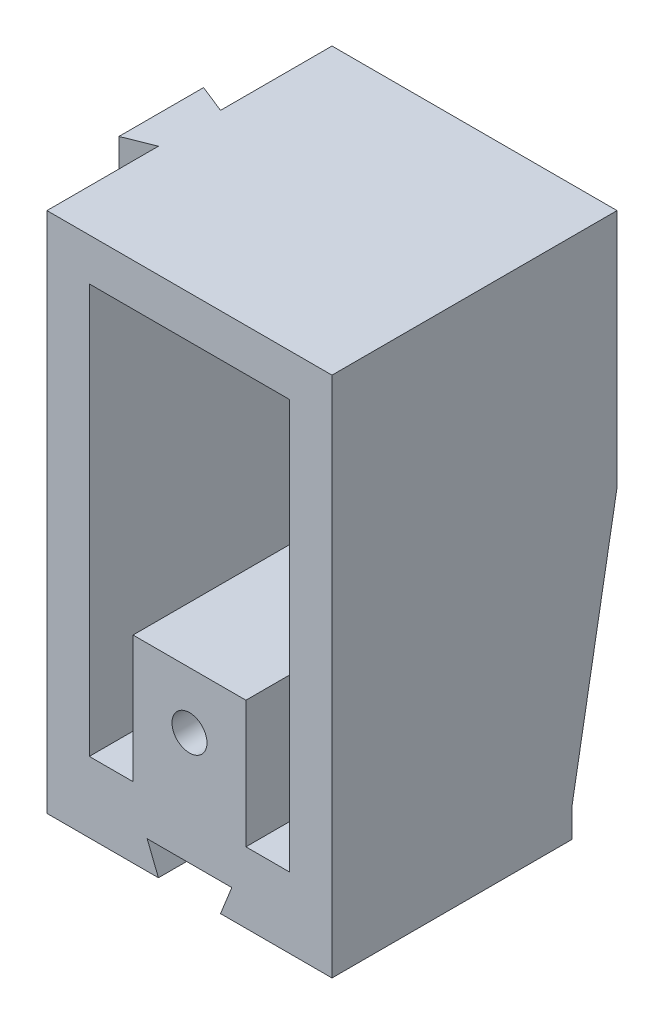
ISO-10303-21;
HEADER;
FILE_DESCRIPTION(('STEP AP214'),'2;1');
FILE_NAME('part.step','',(''),(''),'','','');
FILE_SCHEMA(('AUTOMOTIVE_DESIGN { 1 0 10303 214 1 1 1 1 }'));
ENDSEC;
DATA;
#1=APPLICATION_CONTEXT('core data for automotive mechanical design processes');
#2=APPLICATION_PROTOCOL_DEFINITION('international standard','automotive_design',2000,#1);
#3=PRODUCT_CONTEXT('',#1,'mechanical');
#4=PRODUCT('Part','Part','',(#3));
#5=PRODUCT_RELATED_PRODUCT_CATEGORY('part','',(#4));
#6=PRODUCT_DEFINITION_FORMATION('','',#4);
#7=PRODUCT_DEFINITION_CONTEXT('part definition',#1,'design');
#8=PRODUCT_DEFINITION('design','',#6,#7);
#9=PRODUCT_DEFINITION_SHAPE('','',#8);
#10=(LENGTH_UNIT() NAMED_UNIT(*) SI_UNIT(.MILLI.,.METRE.));
#11=(NAMED_UNIT(*) PLANE_ANGLE_UNIT() SI_UNIT($,.RADIAN.));
#12=(NAMED_UNIT(*) SI_UNIT($,.STERADIAN.) SOLID_ANGLE_UNIT());
#13=UNCERTAINTY_MEASURE_WITH_UNIT(LENGTH_MEASURE(1.E-05),#10,'distance_accuracy_value','');
#14=(GEOMETRIC_REPRESENTATION_CONTEXT(3) GLOBAL_UNCERTAINTY_ASSIGNED_CONTEXT((#13)) GLOBAL_UNIT_ASSIGNED_CONTEXT((#10,
#11,#12)) REPRESENTATION_CONTEXT('',''));
#15=CARTESIAN_POINT('',(0.,0.,0.));
#16=DIRECTION('',(0.,0.,1.));
#17=DIRECTION('',(1.,0.,0.));
#18=AXIS2_PLACEMENT_3D('',#15,#16,#17);
#19=CARTESIAN_POINT('',(50.5,42.5,-25.25));
#20=DIRECTION('',(0.,0.,-1.));
#21=DIRECTION('',(1.,0.,0.));
#22=AXIS2_PLACEMENT_3D('',#19,#20,#21);
#23=PLANE('',#22);
#24=DIRECTION('',(-1.,0.,0.));
#25=VECTOR('',#24,1.);
#26=CARTESIAN_POINT('',(95.25,0.,-25.25));
#27=LINE('',#26,#25);
#28=CARTESIAN_POINT('',(32.75,0.,-25.25));
#29=VERTEX_POINT('',#28);
#30=CARTESIAN_POINT('',(25.25,0.,-25.25));
#31=VERTEX_POINT('',#30);
#32=EDGE_CURVE('E267',#29,#31,#27,.T.);
#33=ORIENTED_EDGE('',*,*,#32,.T.);
#34=DIRECTION('',(0.,-1.,0.));
#35=VECTOR('',#34,1.);
#36=CARTESIAN_POINT('',(25.25,42.5,-25.25));
#37=LINE('',#36,#35);
#38=CARTESIAN_POINT('',(25.25,42.5,-25.25));
#39=VERTEX_POINT('',#38);
#40=EDGE_CURVE('E308',#39,#31,#37,.T.);
#41=ORIENTED_EDGE('',*,*,#40,.F.);
#42=DIRECTION('',(-1.,0.,0.));
#43=VECTOR('',#42,1.);
#44=CARTESIAN_POINT('',(50.5,42.5,-25.25));
#45=LINE('',#44,#43);
#46=CARTESIAN_POINT('',(75.75,42.5,-25.25));
#47=VERTEX_POINT('',#46);
#48=EDGE_CURVE('E312',#47,#39,#45,.T.);
#49=ORIENTED_EDGE('',*,*,#48,.F.);
#50=DIRECTION('',(0.,-1.,0.));
#51=VECTOR('',#50,1.);
#52=CARTESIAN_POINT('',(75.75,42.5,-25.25));
#53=LINE('',#52,#51);
#54=CARTESIAN_POINT('',(75.75,0.,-25.25));
#55=VERTEX_POINT('',#54);
#56=EDGE_CURVE('E349',#47,#55,#53,.T.);
#57=ORIENTED_EDGE('',*,*,#56,.T.);
#58=CARTESIAN_POINT('',(68.25,0.,-25.25));
#59=VERTEX_POINT('',#58);
#60=EDGE_CURVE('E263',#55,#59,#27,.T.);
#61=ORIENTED_EDGE('',*,*,#60,.T.);
#62=DIRECTION('',(0.,1.,0.));
#63=VECTOR('',#62,1.);
#64=CARTESIAN_POINT('',(68.25,42.5,-25.25));
#65=LINE('',#64,#63);
#66=CARTESIAN_POINT('',(68.25,35.,-25.25));
#67=VERTEX_POINT('',#66);
#68=EDGE_CURVE('E238',#59,#67,#65,.T.);
#69=ORIENTED_EDGE('',*,*,#68,.T.);
#70=DIRECTION('',(1.,0.,0.));
#71=VECTOR('',#70,1.);
#72=CARTESIAN_POINT('',(50.5,35.,-25.25));
#73=LINE('',#72,#71);
#74=CARTESIAN_POINT('',(32.75,35.,-25.25));
#75=VERTEX_POINT('',#74);
#76=EDGE_CURVE('E205',#75,#67,#73,.T.);
#77=ORIENTED_EDGE('',*,*,#76,.F.);
#78=DIRECTION('',(0.,1.,0.));
#79=VECTOR('',#78,1.);
#80=CARTESIAN_POINT('',(32.75,42.5,-25.25));
#81=LINE('',#80,#79);
#82=EDGE_CURVE('E250',#29,#75,#81,.T.);
#83=ORIENTED_EDGE('',*,*,#82,.F.);
#84=EDGE_LOOP('',(#33,#41,#49,#57,#61,#69,#77,#83));
#85=FACE_BOUND('',#84,.T.);
#86=ADVANCED_FACE('F43',(#85),#23,.T.);
#87=CARTESIAN_POINT('',(50.5,42.5,25.25));
#88=DIRECTION('',(0.,0.,-1.));
#89=DIRECTION('',(1.,0.,0.));
#90=AXIS2_PLACEMENT_3D('',#87,#88,#89);
#91=PLANE('',#90);
#92=DIRECTION('',(-1.,0.,0.));
#93=VECTOR('',#92,1.);
#94=CARTESIAN_POINT('',(50.5,-45.,25.25));
#95=LINE('',#94,#93);
#96=CARTESIAN_POINT('',(58.,-45.,25.25));
#97=VERTEX_POINT('',#96);
#98=CARTESIAN_POINT('',(43.,-45.,25.25));
#99=VERTEX_POINT('',#98);
#100=EDGE_CURVE('E358',#97,#99,#95,.T.);
#101=ORIENTED_EDGE('',*,*,#100,.F.);
#102=DIRECTION('',(0.371390676354104,0.92847669088526,0.));
#103=VECTOR('',#102,1.);
#104=CARTESIAN_POINT('',(87.1379310344828,27.8448275862069,25.25));
#105=LINE('',#104,#103);
#106=CARTESIAN_POINT('',(56.,-50.,25.25));
#107=VERTEX_POINT('',#106);
#108=EDGE_CURVE('E287',#107,#97,#105,.T.);
#109=ORIENTED_EDGE('',*,*,#108,.F.);
#110=DIRECTION('',(-1.,0.,0.));
#111=VECTOR('',#110,1.);
#112=CARTESIAN_POINT('',(50.5,-50.,25.25));
#113=LINE('',#112,#111);
#114=CARTESIAN_POINT('',(75.75,-50.,25.25));
#115=VERTEX_POINT('',#114);
#116=EDGE_CURVE('E300',#115,#107,#113,.T.);
#117=ORIENTED_EDGE('',*,*,#116,.F.);
#118=DIRECTION('',(0.,-1.,0.));
#119=VECTOR('',#118,1.);
#120=CARTESIAN_POINT('',(75.75,42.5,25.25));
#121=LINE('',#120,#119);
#122=CARTESIAN_POINT('',(75.75,42.5,25.25));
#123=VERTEX_POINT('',#122);
#124=EDGE_CURVE('E346',#123,#115,#121,.T.);
#125=ORIENTED_EDGE('',*,*,#124,.F.);
#126=DIRECTION('',(-1.,0.,0.));
#127=VECTOR('',#126,1.);
#128=CARTESIAN_POINT('',(50.5,42.5,25.25));
#129=LINE('',#128,#127);
#130=CARTESIAN_POINT('',(25.25,42.5,25.25));
#131=VERTEX_POINT('',#130);
#132=EDGE_CURVE('E319',#123,#131,#129,.T.);
#133=ORIENTED_EDGE('',*,*,#132,.T.);
#134=DIRECTION('',(0.,-1.,0.));
#135=VECTOR('',#134,1.);
#136=CARTESIAN_POINT('',(25.25,42.5,25.25));
#137=LINE('',#136,#135);
#138=CARTESIAN_POINT('',(25.25,-50.,25.25));
#139=VERTEX_POINT('',#138);
#140=EDGE_CURVE('E343',#131,#139,#137,.T.);
#141=ORIENTED_EDGE('',*,*,#140,.T.);
#142=CARTESIAN_POINT('',(45.,-50.,25.25));
#143=VERTEX_POINT('',#142);
#144=EDGE_CURVE('E299',#143,#139,#113,.T.);
#145=ORIENTED_EDGE('',*,*,#144,.F.);
#146=DIRECTION('',(0.371390676354104,-0.92847669088526,0.));
#147=VECTOR('',#146,1.);
#148=CARTESIAN_POINT('',(13.8620689655173,27.8448275862069,25.25));
#149=LINE('',#148,#147);
#150=EDGE_CURVE('E292',#99,#143,#149,.T.);
#151=ORIENTED_EDGE('',*,*,#150,.F.);
#152=EDGE_LOOP('',(#101,#109,#117,#125,#133,#141,#145,#151));
#153=FACE_BOUND('',#152,.T.);
#154=CARTESIAN_POINT('',(50.5,-25.,25.25));
#155=DIRECTION('',(0.,0.,-1.));
#156=DIRECTION('',(-1.,0.,0.));
#157=AXIS2_PLACEMENT_3D('',#154,#155,#156);
#158=CIRCLE('',#157,3.1);
#159=CARTESIAN_POINT('',(47.4,-25.,25.25));
#160=VERTEX_POINT('',#159);
#161=EDGE_CURVE('E253',#160,#160,#158,.T.);
#162=ORIENTED_EDGE('',*,*,#161,.T.);
#163=EDGE_LOOP('',(#162));
#164=FACE_BOUND('',#163,.T.);
#165=DIRECTION('',(0.,-1.,0.));
#166=VECTOR('',#165,1.);
#167=CARTESIAN_POINT('',(32.75,0.,25.25));
#168=LINE('',#167,#166);
#169=CARTESIAN_POINT('',(32.75,35.,25.25));
#170=VERTEX_POINT('',#169);
#171=CARTESIAN_POINT('',(32.75,-37.5,25.25));
#172=VERTEX_POINT('',#171);
#173=EDGE_CURVE('E219',#170,#172,#168,.T.);
#174=ORIENTED_EDGE('',*,*,#173,.F.);
#175=DIRECTION('',(-1.,0.,0.));
#176=VECTOR('',#175,1.);
#177=CARTESIAN_POINT('',(50.5,35.,25.25));
#178=LINE('',#177,#176);
#179=CARTESIAN_POINT('',(68.25,35.,25.25));
#180=VERTEX_POINT('',#179);
#181=EDGE_CURVE('E202',#180,#170,#178,.T.);
#182=ORIENTED_EDGE('',*,*,#181,.F.);
#183=DIRECTION('',(0.,-1.,0.));
#184=VECTOR('',#183,1.);
#185=CARTESIAN_POINT('',(68.25,0.,25.25));
#186=LINE('',#185,#184);
#187=CARTESIAN_POINT('',(68.25,-37.5,25.25));
#188=VERTEX_POINT('',#187);
#189=EDGE_CURVE('E211',#180,#188,#186,.T.);
#190=ORIENTED_EDGE('',*,*,#189,.T.);
#191=DIRECTION('',(-1.,0.,0.));
#192=VECTOR('',#191,1.);
#193=CARTESIAN_POINT('',(50.5,-37.5,25.25));
#194=LINE('',#193,#192);
#195=CARTESIAN_POINT('',(60.5,-37.5,25.25));
#196=VERTEX_POINT('',#195);
#197=EDGE_CURVE('E215',#188,#196,#194,.T.);
#198=ORIENTED_EDGE('',*,*,#197,.T.);
#199=DIRECTION('',(0.,-1.,0.));
#200=VECTOR('',#199,1.);
#201=CARTESIAN_POINT('',(60.5,0.,25.25));
#202=LINE('',#201,#200);
#203=CARTESIAN_POINT('',(60.5,-15.,25.25));
#204=VERTEX_POINT('',#203);
#205=EDGE_CURVE('E224',#204,#196,#202,.T.);
#206=ORIENTED_EDGE('',*,*,#205,.F.);
#207=DIRECTION('',(-1.,0.,0.));
#208=VECTOR('',#207,1.);
#209=CARTESIAN_POINT('',(50.5,-15.,25.25));
#210=LINE('',#209,#208);
#211=CARTESIAN_POINT('',(40.5,-15.,25.25));
#212=VERTEX_POINT('',#211);
#213=EDGE_CURVE('E227',#204,#212,#210,.T.);
#214=ORIENTED_EDGE('',*,*,#213,.T.);
#215=DIRECTION('',(0.,-1.,0.));
#216=VECTOR('',#215,1.);
#217=CARTESIAN_POINT('',(40.5,0.,25.25));
#218=LINE('',#217,#216);
#219=CARTESIAN_POINT('',(40.5,-37.5,25.25));
#220=VERTEX_POINT('',#219);
#221=EDGE_CURVE('E230',#212,#220,#218,.T.);
#222=ORIENTED_EDGE('',*,*,#221,.T.);
#223=DIRECTION('',(1.,0.,0.));
#224=VECTOR('',#223,1.);
#225=CARTESIAN_POINT('',(50.5,-37.5,25.25));
#226=LINE('',#225,#224);
#227=EDGE_CURVE('E233',#172,#220,#226,.T.);
#228=ORIENTED_EDGE('',*,*,#227,.F.);
#229=EDGE_LOOP('',(#174,#182,#190,#198,#206,#214,#222,#228));
#230=FACE_BOUND('',#229,.T.);
#231=ADVANCED_FACE('F217',(#153,#164,#230),#91,.F.);
#232=CARTESIAN_POINT('',(95.25,-45.,-17.25));
#233=DIRECTION('',(0.,0.175033334717495,0.984562507785907));
#234=DIRECTION('',(0.,-0.984562507785907,0.175033334717495));
#235=AXIS2_PLACEMENT_3D('',#232,#233,#234);
#236=PLANE('',#235);
#237=CARTESIAN_POINT('',(50.5,-25.,-20.8055555555556));
#238=DIRECTION('',(0.,-0.175033334717495,-0.984562507785907));
#239=DIRECTION('',(0.,-0.984562507785907,0.175033334717495));
#240=AXIS2_PLACEMENT_3D('',#237,#238,#239);
#241=ELLIPSE('',#240,3.14860658971395,3.1);
#242=CARTESIAN_POINT('',(50.5,-28.1,-20.2544444444444));
#243=VERTEX_POINT('',#242);
#244=EDGE_CURVE('E256',#243,#243,#241,.T.);
#245=ORIENTED_EDGE('',*,*,#244,.F.);
#246=EDGE_LOOP('',(#245));
#247=FACE_BOUND('',#246,.T.);
#248=DIRECTION('',(0.,-0.984562507785907,0.175033334717495));
#249=VECTOR('',#248,1.);
#250=CARTESIAN_POINT('',(32.75,-45.,-17.25));
#251=LINE('',#250,#249);
#252=CARTESIAN_POINT('',(32.75,-37.5,-18.5833333333333));
#253=VERTEX_POINT('',#252);
#254=EDGE_CURVE('E11',#29,#253,#251,.T.);
#255=ORIENTED_EDGE('',*,*,#254,.T.);
#256=DIRECTION('',(1.,0.,0.));
#257=VECTOR('',#256,1.);
#258=CARTESIAN_POINT('',(95.25,-37.5,-18.5833333333333));
#259=LINE('',#258,#257);
#260=CARTESIAN_POINT('',(40.5,-37.5,-18.5833333333333));
#261=VERTEX_POINT('',#260);
#262=EDGE_CURVE('E50',#253,#261,#259,.T.);
#263=ORIENTED_EDGE('',*,*,#262,.T.);
#264=DIRECTION('',(0.,-0.984562507785907,0.175033334717495));
#265=VECTOR('',#264,1.);
#266=CARTESIAN_POINT('',(40.5,-45.,-17.25));
#267=LINE('',#266,#265);
#268=CARTESIAN_POINT('',(40.5,-15.,-22.5833333333333));
#269=VERTEX_POINT('',#268);
#270=EDGE_CURVE('E375',#269,#261,#267,.T.);
#271=ORIENTED_EDGE('',*,*,#270,.F.);
#272=DIRECTION('',(-1.,0.,0.));
#273=VECTOR('',#272,1.);
#274=CARTESIAN_POINT('',(95.25,-15.,-22.5833333333333));
#275=LINE('',#274,#273);
#276=CARTESIAN_POINT('',(60.5,-15.,-22.5833333333333));
#277=VERTEX_POINT('',#276);
#278=EDGE_CURVE('E372',#277,#269,#275,.T.);
#279=ORIENTED_EDGE('',*,*,#278,.F.);
#280=DIRECTION('',(0.,-0.984562507785907,0.175033334717495));
#281=VECTOR('',#280,1.);
#282=CARTESIAN_POINT('',(60.5,-45.,-17.25));
#283=LINE('',#282,#281);
#284=CARTESIAN_POINT('',(60.5,-37.5,-18.5833333333333));
#285=VERTEX_POINT('',#284);
#286=EDGE_CURVE('E369',#277,#285,#283,.T.);
#287=ORIENTED_EDGE('',*,*,#286,.T.);
#288=DIRECTION('',(-1.,0.,0.));
#289=VECTOR('',#288,1.);
#290=CARTESIAN_POINT('',(95.25,-37.5,-18.5833333333333));
#291=LINE('',#290,#289);
#292=CARTESIAN_POINT('',(68.25,-37.5,-18.5833333333333));
#293=VERTEX_POINT('',#292);
#294=EDGE_CURVE('E367',#293,#285,#291,.T.);
#295=ORIENTED_EDGE('',*,*,#294,.F.);
#296=DIRECTION('',(0.,-0.984562507785907,0.175033334717495));
#297=VECTOR('',#296,1.);
#298=CARTESIAN_POINT('',(68.25,-45.,-17.25));
#299=LINE('',#298,#297);
#300=EDGE_CURVE('E363',#59,#293,#299,.T.);
#301=ORIENTED_EDGE('',*,*,#300,.F.);
#302=ORIENTED_EDGE('',*,*,#60,.F.);
#303=DIRECTION('',(0.,-0.984562507785907,0.175033334717495));
#304=VECTOR('',#303,1.);
#305=CARTESIAN_POINT('',(75.75,36.8465773097176,-31.8005026328387));
#306=LINE('',#305,#304);
#307=CARTESIAN_POINT('',(75.75,-45.,-17.25));
#308=VERTEX_POINT('',#307);
#309=EDGE_CURVE('E280',#55,#308,#306,.T.);
#310=ORIENTED_EDGE('',*,*,#309,.T.);
#311=DIRECTION('',(-1.,0.,0.));
#312=VECTOR('',#311,1.);
#313=CARTESIAN_POINT('',(95.25,-45.,-17.25));
#314=LINE('',#313,#312);
#315=CARTESIAN_POINT('',(58.,-45.,-17.25));
#316=VERTEX_POINT('',#315);
#317=EDGE_CURVE('E272',#308,#316,#314,.T.);
#318=ORIENTED_EDGE('',*,*,#317,.T.);
#319=CARTESIAN_POINT('',(43.,-45.,-17.25));
#320=VERTEX_POINT('',#319);
#321=EDGE_CURVE('E275',#316,#320,#314,.T.);
#322=ORIENTED_EDGE('',*,*,#321,.T.);
#323=CARTESIAN_POINT('',(25.25,-45.,-17.25));
#324=VERTEX_POINT('',#323);
#325=EDGE_CURVE('E262',#320,#324,#314,.T.);
#326=ORIENTED_EDGE('',*,*,#325,.T.);
#327=DIRECTION('',(0.,-0.984562507785907,0.175033334717495));
#328=VECTOR('',#327,1.);
#329=CARTESIAN_POINT('',(25.25,-45.,-17.25));
#330=LINE('',#329,#328);
#331=EDGE_CURVE('E257',#31,#324,#330,.T.);
#332=ORIENTED_EDGE('',*,*,#331,.F.);
#333=ORIENTED_EDGE('',*,*,#32,.F.);
#334=EDGE_LOOP('',(#255,#263,#271,#279,#287,#295,#301,#302,#310,#318,#322,#326,#332,#333));
#335=FACE_BOUND('',#334,.T.);
#336=ADVANCED_FACE('F381',(#247,#335),#236,.F.);
#337=CARTESIAN_POINT('',(50.5,-50.,0.));
#338=DIRECTION('',(0.,1.,0.));
#339=DIRECTION('',(0.,0.,1.));
#340=AXIS2_PLACEMENT_3D('',#337,#338,#339);
#341=PLANE('',#340);
#342=DIRECTION('',(0.,0.,-1.));
#343=VECTOR('',#342,1.);
#344=CARTESIAN_POINT('',(45.,-50.,0.));
#345=LINE('',#344,#343);
#346=CARTESIAN_POINT('',(45.,-50.,-17.25));
#347=VERTEX_POINT('',#346);
#348=EDGE_CURVE('E355',#143,#347,#345,.T.);
#349=ORIENTED_EDGE('',*,*,#348,.F.);
#350=ORIENTED_EDGE('',*,*,#144,.T.);
#351=DIRECTION('',(0.,0.,1.));
#352=VECTOR('',#351,1.);
#353=CARTESIAN_POINT('',(25.25,-50.,0.));
#354=LINE('',#353,#352);
#355=CARTESIAN_POINT('',(25.25,-50.,-17.25));
#356=VERTEX_POINT('',#355);
#357=EDGE_CURVE('E295',#356,#139,#354,.T.);
#358=ORIENTED_EDGE('',*,*,#357,.F.);
#359=DIRECTION('',(-1.,0.,0.));
#360=VECTOR('',#359,1.);
#361=CARTESIAN_POINT('',(95.25,-50.,-17.25));
#362=LINE('',#361,#360);
#363=EDGE_CURVE('E268',#347,#356,#362,.T.);
#364=ORIENTED_EDGE('',*,*,#363,.F.);
#365=EDGE_LOOP('',(#349,#350,#358,#364));
#366=FACE_BOUND('',#365,.T.);
#367=ADVANCED_FACE('F455',(#366),#341,.F.);
#368=CARTESIAN_POINT('',(50.5,0.,0.));
#369=DIRECTION('',(0.,1.,0.));
#370=DIRECTION('',(0.,0.,1.));
#371=AXIS2_PLACEMENT_3D('',#368,#369,#370);
#372=PLANE('',#371);
#373=DIRECTION('',(0.,0.,1.));
#374=VECTOR('',#373,1.);
#375=CARTESIAN_POINT('',(25.25,0.,0.));
#376=LINE('',#375,#374);
#377=CARTESIAN_POINT('',(25.25,0.,-5.5));
#378=VERTEX_POINT('',#377);
#379=CARTESIAN_POINT('',(25.25,0.,5.49999999999999));
#380=VERTEX_POINT('',#379);
#381=EDGE_CURVE('E304',#378,#380,#376,.T.);
#382=ORIENTED_EDGE('',*,*,#381,.T.);
#383=DIRECTION('',(0.928476690885259,0.,-0.371390676354106));
#384=VECTOR('',#383,1.);
#385=CARTESIAN_POINT('',(48.9137931034483,0.,-3.96551724137938));
#386=LINE('',#385,#384);
#387=CARTESIAN_POINT('',(20.25,0.,7.5));
#388=VERTEX_POINT('',#387);
#389=EDGE_CURVE('E303',#388,#380,#386,.T.);
#390=ORIENTED_EDGE('',*,*,#389,.F.);
#391=DIRECTION('',(0.,0.,1.));
#392=VECTOR('',#391,1.);
#393=CARTESIAN_POINT('',(20.25,0.,0.));
#394=LINE('',#393,#392);
#395=CARTESIAN_POINT('',(20.25,0.,-7.5));
#396=VERTEX_POINT('',#395);
#397=EDGE_CURVE('E331',#396,#388,#394,.T.);
#398=ORIENTED_EDGE('',*,*,#397,.F.);
#399=DIRECTION('',(-0.928476690885259,0.,-0.371390676354104));
#400=VECTOR('',#399,1.);
#401=CARTESIAN_POINT('',(48.9137931034483,0.,3.96551724137931));
#402=LINE('',#401,#400);
#403=EDGE_CURVE('E313',#378,#396,#402,.T.);
#404=ORIENTED_EDGE('',*,*,#403,.F.);
#405=EDGE_LOOP('',(#382,#390,#398,#404));
#406=FACE_BOUND('',#405,.T.);
#407=ADVANCED_FACE('F473',(#406),#372,.F.);
#408=CARTESIAN_POINT('',(75.75,42.5,0.));
#409=DIRECTION('',(-1.,0.,0.));
#410=DIRECTION('',(0.,0.,-1.));
#411=AXIS2_PLACEMENT_3D('',#408,#409,#410);
#412=PLANE('',#411);
#413=ORIENTED_EDGE('',*,*,#56,.F.);
#414=DIRECTION('',(0.,0.,1.));
#415=VECTOR('',#414,1.);
#416=CARTESIAN_POINT('',(75.75,42.5,0.));
#417=LINE('',#416,#415);
#418=EDGE_CURVE('E317',#47,#123,#417,.T.);
#419=ORIENTED_EDGE('',*,*,#418,.T.);
#420=ORIENTED_EDGE('',*,*,#124,.T.);
#421=DIRECTION('',(0.,0.,1.));
#422=VECTOR('',#421,1.);
#423=CARTESIAN_POINT('',(75.75,-50.,0.));
#424=LINE('',#423,#422);
#425=CARTESIAN_POINT('',(75.75,-50.,-17.25));
#426=VERTEX_POINT('',#425);
#427=EDGE_CURVE('E297',#426,#115,#424,.T.);
#428=ORIENTED_EDGE('',*,*,#427,.F.);
#429=DIRECTION('',(0.,-1.,0.));
#430=VECTOR('',#429,1.);
#431=CARTESIAN_POINT('',(75.75,42.5,-17.25));
#432=LINE('',#431,#430);
#433=EDGE_CURVE('E277',#308,#426,#432,.T.);
#434=ORIENTED_EDGE('',*,*,#433,.F.);
#435=ORIENTED_EDGE('',*,*,#309,.F.);
#436=EDGE_LOOP('',(#413,#419,#420,#428,#434,#435));
#437=FACE_BOUND('',#436,.T.);
#438=ADVANCED_FACE('F441',(#437),#412,.F.);
#439=CARTESIAN_POINT('',(25.25,42.5,0.));
#440=DIRECTION('',(-1.,0.,0.));
#441=DIRECTION('',(0.,0.,-1.));
#442=AXIS2_PLACEMENT_3D('',#439,#440,#441);
#443=PLANE('',#442);
#444=ORIENTED_EDGE('',*,*,#331,.T.);
#445=DIRECTION('',(0.,-1.,0.));
#446=VECTOR('',#445,1.);
#447=CARTESIAN_POINT('',(25.25,-50.,-17.25));
#448=LINE('',#447,#446);
#449=EDGE_CURVE('E260',#324,#356,#448,.T.);
#450=ORIENTED_EDGE('',*,*,#449,.T.);
#451=ORIENTED_EDGE('',*,*,#357,.T.);
#452=ORIENTED_EDGE('',*,*,#140,.F.);
#453=DIRECTION('',(0.,0.,1.));
#454=VECTOR('',#453,1.);
#455=CARTESIAN_POINT('',(25.25,42.5,0.));
#456=LINE('',#455,#454);
#457=CARTESIAN_POINT('',(25.25,42.5,5.49999999999999));
#458=VERTEX_POINT('',#457);
#459=EDGE_CURVE('E314',#458,#131,#456,.T.);
#460=ORIENTED_EDGE('',*,*,#459,.F.);
#461=DIRECTION('',(0.,-1.,0.));
#462=VECTOR('',#461,1.);
#463=CARTESIAN_POINT('',(25.25,42.5,5.49999999999999));
#464=LINE('',#463,#462);
#465=EDGE_CURVE('E341',#458,#380,#464,.T.);
#466=ORIENTED_EDGE('',*,*,#465,.T.);
#467=ORIENTED_EDGE('',*,*,#381,.F.);
#468=DIRECTION('',(0.,-1.,0.));
#469=VECTOR('',#468,1.);
#470=CARTESIAN_POINT('',(25.25,42.5,-5.5));
#471=LINE('',#470,#469);
#472=CARTESIAN_POINT('',(25.25,42.5,-5.5));
#473=VERTEX_POINT('',#472);
#474=EDGE_CURVE('E328',#473,#378,#471,.T.);
#475=ORIENTED_EDGE('',*,*,#474,.F.);
#476=EDGE_CURVE('E309',#39,#473,#456,.T.);
#477=ORIENTED_EDGE('',*,*,#476,.F.);
#478=ORIENTED_EDGE('',*,*,#40,.T.);
#479=EDGE_LOOP('',(#444,#450,#451,#452,#460,#466,#467,#475,#477,#478));
#480=FACE_BOUND('',#479,.T.);
#481=ADVANCED_FACE('F458',(#480),#443,.T.);
#482=CARTESIAN_POINT('',(48.9137931034483,42.5,-3.96551724137938));
#483=DIRECTION('',(0.371390676354106,0.,0.928476690885258));
#484=DIRECTION('',(-0.928476690885259,0.,0.371390676354106));
#485=AXIS2_PLACEMENT_3D('',#482,#483,#484);
#486=PLANE('',#485);
#487=ORIENTED_EDGE('',*,*,#389,.T.);
#488=ORIENTED_EDGE('',*,*,#465,.F.);
#489=DIRECTION('',(0.928476690885259,0.,-0.371390676354106));
#490=VECTOR('',#489,1.);
#491=CARTESIAN_POINT('',(48.9137931034483,42.5,-3.96551724137938));
#492=LINE('',#491,#490);
#493=CARTESIAN_POINT('',(20.25,42.5,7.5));
#494=VERTEX_POINT('',#493);
#495=EDGE_CURVE('E322',#494,#458,#492,.T.);
#496=ORIENTED_EDGE('',*,*,#495,.F.);
#497=DIRECTION('',(0.,-1.,0.));
#498=VECTOR('',#497,1.);
#499=CARTESIAN_POINT('',(20.25,42.5,7.5));
#500=LINE('',#499,#498);
#501=EDGE_CURVE('E339',#494,#388,#500,.T.);
#502=ORIENTED_EDGE('',*,*,#501,.T.);
#503=EDGE_LOOP('',(#487,#488,#496,#502));
#504=FACE_BOUND('',#503,.T.);
#505=ADVANCED_FACE('F468',(#504),#486,.T.);
#506=CARTESIAN_POINT('',(20.25,42.5,0.));
#507=DIRECTION('',(-1.,0.,0.));
#508=DIRECTION('',(0.,0.,-1.));
#509=AXIS2_PLACEMENT_3D('',#506,#507,#508);
#510=PLANE('',#509);
#511=ORIENTED_EDGE('',*,*,#397,.T.);
#512=ORIENTED_EDGE('',*,*,#501,.F.);
#513=DIRECTION('',(0.,0.,1.));
#514=VECTOR('',#513,1.);
#515=CARTESIAN_POINT('',(20.25,42.5,0.));
#516=LINE('',#515,#514);
#517=CARTESIAN_POINT('',(20.25,42.5,-7.5));
#518=VERTEX_POINT('',#517);
#519=EDGE_CURVE('E324',#518,#494,#516,.T.);
#520=ORIENTED_EDGE('',*,*,#519,.F.);
#521=DIRECTION('',(0.,-1.,0.));
#522=VECTOR('',#521,1.);
#523=CARTESIAN_POINT('',(20.25,42.5,-7.5));
#524=LINE('',#523,#522);
#525=EDGE_CURVE('E337',#518,#396,#524,.T.);
#526=ORIENTED_EDGE('',*,*,#525,.T.);
#527=EDGE_LOOP('',(#511,#512,#520,#526));
#528=FACE_BOUND('',#527,.T.);
#529=ADVANCED_FACE('F479',(#528),#510,.T.);
#530=CARTESIAN_POINT('',(48.9137931034483,42.5,3.96551724137931));
#531=DIRECTION('',(0.371390676354104,0.,-0.928476690885259));
#532=DIRECTION('',(0.928476690885259,0.,0.371390676354104));
#533=AXIS2_PLACEMENT_3D('',#530,#531,#532);
#534=PLANE('',#533);
#535=ORIENTED_EDGE('',*,*,#403,.T.);
#536=ORIENTED_EDGE('',*,*,#525,.F.);
#537=DIRECTION('',(-0.928476690885259,0.,-0.371390676354104));
#538=VECTOR('',#537,1.);
#539=CARTESIAN_POINT('',(48.9137931034483,42.5,3.96551724137931));
#540=LINE('',#539,#538);
#541=EDGE_CURVE('E326',#473,#518,#540,.T.);
#542=ORIENTED_EDGE('',*,*,#541,.F.);
#543=ORIENTED_EDGE('',*,*,#474,.T.);
#544=EDGE_LOOP('',(#535,#536,#542,#543));
#545=FACE_BOUND('',#544,.T.);
#546=ADVANCED_FACE('F476',(#545),#534,.T.);
#547=CARTESIAN_POINT('',(50.5,42.5,0.));
#548=DIRECTION('',(0.,1.,0.));
#549=DIRECTION('',(0.,0.,1.));
#550=AXIS2_PLACEMENT_3D('',#547,#548,#549);
#551=PLANE('',#550);
#552=ORIENTED_EDGE('',*,*,#476,.T.);
#553=ORIENTED_EDGE('',*,*,#541,.T.);
#554=ORIENTED_EDGE('',*,*,#519,.T.);
#555=ORIENTED_EDGE('',*,*,#495,.T.);
#556=ORIENTED_EDGE('',*,*,#459,.T.);
#557=ORIENTED_EDGE('',*,*,#132,.F.);
#558=ORIENTED_EDGE('',*,*,#418,.F.);
#559=ORIENTED_EDGE('',*,*,#48,.T.);
#560=EDGE_LOOP('',(#552,#553,#554,#555,#556,#557,#558,#559));
#561=FACE_BOUND('',#560,.T.);
#562=ADVANCED_FACE('F463',(#561),#551,.T.);
#563=ORIENTED_EDGE('',*,*,#427,.T.);
#564=ORIENTED_EDGE('',*,*,#116,.T.);
#565=DIRECTION('',(0.,0.,1.));
#566=VECTOR('',#565,1.);
#567=CARTESIAN_POINT('',(56.,-50.,0.));
#568=LINE('',#567,#566);
#569=CARTESIAN_POINT('',(56.,-50.,-17.25));
#570=VERTEX_POINT('',#569);
#571=EDGE_CURVE('E307',#570,#107,#568,.T.);
#572=ORIENTED_EDGE('',*,*,#571,.F.);
#573=EDGE_CURVE('E271',#426,#570,#362,.T.);
#574=ORIENTED_EDGE('',*,*,#573,.F.);
#575=EDGE_LOOP('',(#563,#564,#572,#574));
#576=FACE_BOUND('',#575,.T.);
#577=ADVANCED_FACE('F426',(#576),#341,.F.);
#578=CARTESIAN_POINT('',(43.,-45.,44.75));
#579=DIRECTION('',(0.,1.,0.));
#580=DIRECTION('',(0.,0.,1.));
#581=AXIS2_PLACEMENT_3D('',#578,#579,#580);
#582=PLANE('',#581);
#583=DIRECTION('',(0.,0.,-1.));
#584=VECTOR('',#583,1.);
#585=CARTESIAN_POINT('',(58.,-45.,44.75));
#586=LINE('',#585,#584);
#587=EDGE_CURVE('E283',#97,#316,#586,.T.);
#588=ORIENTED_EDGE('',*,*,#587,.F.);
#589=ORIENTED_EDGE('',*,*,#100,.T.);
#590=DIRECTION('',(0.,0.,-1.));
#591=VECTOR('',#590,1.);
#592=CARTESIAN_POINT('',(43.,-45.,44.75));
#593=LINE('',#592,#591);
#594=EDGE_CURVE('E284',#99,#320,#593,.T.);
#595=ORIENTED_EDGE('',*,*,#594,.T.);
#596=ORIENTED_EDGE('',*,*,#321,.F.);
#597=EDGE_LOOP('',(#588,#589,#595,#596));
#598=FACE_BOUND('',#597,.T.);
#599=ADVANCED_FACE('F436',(#598),#582,.F.);
#600=CARTESIAN_POINT('',(45.,-50.,44.75));
#601=DIRECTION('',(-0.928476690885259,-0.371390676354104,0.));
#602=DIRECTION('',(-0.371390676354104,0.92847669088526,0.));
#603=AXIS2_PLACEMENT_3D('',#600,#601,#602);
#604=PLANE('',#603);
#605=ORIENTED_EDGE('',*,*,#594,.F.);
#606=ORIENTED_EDGE('',*,*,#150,.T.);
#607=ORIENTED_EDGE('',*,*,#348,.T.);
#608=DIRECTION('',(0.371390676354104,-0.92847669088526,0.));
#609=VECTOR('',#608,1.);
#610=CARTESIAN_POINT('',(45.,-50.,-17.25));
#611=LINE('',#610,#609);
#612=EDGE_CURVE('E266',#320,#347,#611,.T.);
#613=ORIENTED_EDGE('',*,*,#612,.F.);
#614=EDGE_LOOP('',(#605,#606,#607,#613));
#615=FACE_BOUND('',#614,.T.);
#616=ADVANCED_FACE('F449',(#615),#604,.F.);
#617=CARTESIAN_POINT('',(58.,-45.,44.75));
#618=DIRECTION('',(0.928476690885259,-0.371390676354104,0.));
#619=DIRECTION('',(-0.371390676354104,-0.92847669088526,0.));
#620=AXIS2_PLACEMENT_3D('',#617,#618,#619);
#621=PLANE('',#620);
#622=ORIENTED_EDGE('',*,*,#571,.T.);
#623=ORIENTED_EDGE('',*,*,#108,.T.);
#624=ORIENTED_EDGE('',*,*,#587,.T.);
#625=DIRECTION('',(0.371390676354104,0.92847669088526,0.));
#626=VECTOR('',#625,1.);
#627=CARTESIAN_POINT('',(58.,-45.,-17.25));
#628=LINE('',#627,#626);
#629=EDGE_CURVE('E361',#570,#316,#628,.T.);
#630=ORIENTED_EDGE('',*,*,#629,.F.);
#631=EDGE_LOOP('',(#622,#623,#624,#630));
#632=FACE_BOUND('',#631,.T.);
#633=ADVANCED_FACE('F430',(#632),#621,.F.);
#634=CARTESIAN_POINT('',(95.25,-50.,-17.25));
#635=DIRECTION('',(0.,0.,1.));
#636=DIRECTION('',(-1.,0.,0.));
#637=AXIS2_PLACEMENT_3D('',#634,#635,#636);
#638=PLANE('',#637);
#639=ORIENTED_EDGE('',*,*,#317,.F.);
#640=ORIENTED_EDGE('',*,*,#433,.T.);
#641=ORIENTED_EDGE('',*,*,#573,.T.);
#642=ORIENTED_EDGE('',*,*,#629,.T.);
#643=EDGE_LOOP('',(#639,#640,#641,#642));
#644=FACE_BOUND('',#643,.T.);
#645=ADVANCED_FACE('F423',(#644),#638,.F.);
#646=ORIENTED_EDGE('',*,*,#325,.F.);
#647=ORIENTED_EDGE('',*,*,#612,.T.);
#648=ORIENTED_EDGE('',*,*,#363,.T.);
#649=ORIENTED_EDGE('',*,*,#449,.F.);
#650=EDGE_LOOP('',(#646,#647,#648,#649));
#651=FACE_BOUND('',#650,.T.);
#652=ADVANCED_FACE('F452',(#651),#638,.F.);
#653=CARTESIAN_POINT('',(50.5,-25.,-44.75));
#654=DIRECTION('',(0.,0.,1.));
#655=DIRECTION('',(-1.,0.,0.));
#656=AXIS2_PLACEMENT_3D('',#653,#654,#655);
#657=CYLINDRICAL_SURFACE('',#656,3.1);
#658=ORIENTED_EDGE('',*,*,#161,.F.);
#659=EDGE_LOOP('',(#658));
#660=FACE_BOUND('',#659,.T.);
#661=ORIENTED_EDGE('',*,*,#244,.T.);
#662=EDGE_LOOP('',(#661));
#663=FACE_BOUND('',#662,.T.);
#664=ADVANCED_FACE('F514',(#660,#663),#657,.F.);
#665=CARTESIAN_POINT('',(50.5,-37.5,-29.75));
#666=DIRECTION('',(0.,1.,0.));
#667=DIRECTION('',(0.,0.,1.));
#668=AXIS2_PLACEMENT_3D('',#665,#666,#667);
#669=PLANE('',#668);
#670=ORIENTED_EDGE('',*,*,#262,.F.);
#671=DIRECTION('',(0.,0.,1.));
#672=VECTOR('',#671,1.);
#673=CARTESIAN_POINT('',(32.75,-37.5,-29.75));
#674=LINE('',#673,#672);
#675=EDGE_CURVE('E236',#253,#172,#674,.T.);
#676=ORIENTED_EDGE('',*,*,#675,.T.);
#677=ORIENTED_EDGE('',*,*,#227,.T.);
#678=DIRECTION('',(0.,0.,1.));
#679=VECTOR('',#678,1.);
#680=CARTESIAN_POINT('',(40.5,-37.5,-29.75));
#681=LINE('',#680,#679);
#682=EDGE_CURVE('E239',#261,#220,#681,.T.);
#683=ORIENTED_EDGE('',*,*,#682,.F.);
#684=EDGE_LOOP('',(#670,#676,#677,#683));
#685=FACE_BOUND('',#684,.T.);
#686=ADVANCED_FACE('F385',(#685),#669,.T.);
#687=CARTESIAN_POINT('',(40.5,0.,-29.75));
#688=DIRECTION('',(1.,0.,0.));
#689=DIRECTION('',(0.,-1.,0.));
#690=AXIS2_PLACEMENT_3D('',#687,#688,#689);
#691=PLANE('',#690);
#692=DIRECTION('',(0.,0.,1.));
#693=VECTOR('',#692,1.);
#694=CARTESIAN_POINT('',(40.5,-15.,-29.75));
#695=LINE('',#694,#693);
#696=EDGE_CURVE('E241',#269,#212,#695,.T.);
#697=ORIENTED_EDGE('',*,*,#696,.F.);
#698=ORIENTED_EDGE('',*,*,#270,.T.);
#699=ORIENTED_EDGE('',*,*,#682,.T.);
#700=ORIENTED_EDGE('',*,*,#221,.F.);
#701=EDGE_LOOP('',(#697,#698,#699,#700));
#702=FACE_BOUND('',#701,.T.);
#703=ADVANCED_FACE('F388',(#702),#691,.F.);
#704=CARTESIAN_POINT('',(50.5,-15.,-29.75));
#705=DIRECTION('',(0.,-1.,0.));
#706=DIRECTION('',(0.,0.,-1.));
#707=AXIS2_PLACEMENT_3D('',#704,#705,#706);
#708=PLANE('',#707);
#709=DIRECTION('',(0.,0.,1.));
#710=VECTOR('',#709,1.);
#711=CARTESIAN_POINT('',(60.5,-15.,-29.75));
#712=LINE('',#711,#710);
#713=EDGE_CURVE('E243',#277,#204,#712,.T.);
#714=ORIENTED_EDGE('',*,*,#713,.F.);
#715=ORIENTED_EDGE('',*,*,#278,.T.);
#716=ORIENTED_EDGE('',*,*,#696,.T.);
#717=ORIENTED_EDGE('',*,*,#213,.F.);
#718=EDGE_LOOP('',(#714,#715,#716,#717));
#719=FACE_BOUND('',#718,.T.);
#720=ADVANCED_FACE('F391',(#719),#708,.F.);
#721=CARTESIAN_POINT('',(60.5,0.,-29.75));
#722=DIRECTION('',(1.,0.,0.));
#723=DIRECTION('',(0.,-1.,0.));
#724=AXIS2_PLACEMENT_3D('',#721,#722,#723);
#725=PLANE('',#724);
#726=ORIENTED_EDGE('',*,*,#286,.F.);
#727=ORIENTED_EDGE('',*,*,#713,.T.);
#728=ORIENTED_EDGE('',*,*,#205,.T.);
#729=DIRECTION('',(0.,0.,1.));
#730=VECTOR('',#729,1.);
#731=CARTESIAN_POINT('',(60.5,-37.5,-29.75));
#732=LINE('',#731,#730);
#733=EDGE_CURVE('E245',#285,#196,#732,.T.);
#734=ORIENTED_EDGE('',*,*,#733,.F.);
#735=EDGE_LOOP('',(#726,#727,#728,#734));
#736=FACE_BOUND('',#735,.T.);
#737=ADVANCED_FACE('F395',(#736),#725,.T.);
#738=CARTESIAN_POINT('',(50.5,-37.5,-29.75));
#739=DIRECTION('',(0.,-1.,0.));
#740=DIRECTION('',(0.,0.,-1.));
#741=AXIS2_PLACEMENT_3D('',#738,#739,#740);
#742=PLANE('',#741);
#743=DIRECTION('',(0.,0.,1.));
#744=VECTOR('',#743,1.);
#745=CARTESIAN_POINT('',(68.25,-37.5,-29.75));
#746=LINE('',#745,#744);
#747=EDGE_CURVE('E65',#293,#188,#746,.T.);
#748=ORIENTED_EDGE('',*,*,#747,.F.);
#749=ORIENTED_EDGE('',*,*,#294,.T.);
#750=ORIENTED_EDGE('',*,*,#733,.T.);
#751=ORIENTED_EDGE('',*,*,#197,.F.);
#752=EDGE_LOOP('',(#748,#749,#750,#751));
#753=FACE_BOUND('',#752,.T.);
#754=ADVANCED_FACE('F397',(#753),#742,.F.);
#755=CARTESIAN_POINT('',(32.75,0.,-29.75));
#756=DIRECTION('',(1.,0.,0.));
#757=DIRECTION('',(0.,-1.,0.));
#758=AXIS2_PLACEMENT_3D('',#755,#756,#757);
#759=PLANE('',#758);
#760=ORIENTED_EDGE('',*,*,#254,.F.);
#761=ORIENTED_EDGE('',*,*,#82,.T.);
#762=DIRECTION('',(0.,0.,1.));
#763=VECTOR('',#762,1.);
#764=CARTESIAN_POINT('',(32.75,35.,-29.75));
#765=LINE('',#764,#763);
#766=EDGE_CURVE('E57',#75,#170,#765,.T.);
#767=ORIENTED_EDGE('',*,*,#766,.T.);
#768=ORIENTED_EDGE('',*,*,#173,.T.);
#769=ORIENTED_EDGE('',*,*,#675,.F.);
#770=EDGE_LOOP('',(#760,#761,#767,#768,#769));
#771=FACE_BOUND('',#770,.T.);
#772=ADVANCED_FACE('F399',(#771),#759,.T.);
#773=CARTESIAN_POINT('',(68.25,0.,-29.75));
#774=DIRECTION('',(1.,0.,0.));
#775=DIRECTION('',(0.,-1.,0.));
#776=AXIS2_PLACEMENT_3D('',#773,#774,#775);
#777=PLANE('',#776);
#778=ORIENTED_EDGE('',*,*,#68,.F.);
#779=ORIENTED_EDGE('',*,*,#300,.T.);
#780=ORIENTED_EDGE('',*,*,#747,.T.);
#781=ORIENTED_EDGE('',*,*,#189,.F.);
#782=DIRECTION('',(0.,0.,1.));
#783=VECTOR('',#782,1.);
#784=CARTESIAN_POINT('',(68.25,35.,-29.75));
#785=LINE('',#784,#783);
#786=EDGE_CURVE('E198',#67,#180,#785,.T.);
#787=ORIENTED_EDGE('',*,*,#786,.F.);
#788=EDGE_LOOP('',(#778,#779,#780,#781,#787));
#789=FACE_BOUND('',#788,.T.);
#790=ADVANCED_FACE('F212',(#789),#777,.F.);
#791=CARTESIAN_POINT('',(50.5,35.,-29.75));
#792=DIRECTION('',(0.,-1.,0.));
#793=DIRECTION('',(0.,0.,-1.));
#794=AXIS2_PLACEMENT_3D('',#791,#792,#793);
#795=PLANE('',#794);
#796=ORIENTED_EDGE('',*,*,#766,.F.);
#797=ORIENTED_EDGE('',*,*,#76,.T.);
#798=ORIENTED_EDGE('',*,*,#786,.T.);
#799=ORIENTED_EDGE('',*,*,#181,.T.);
#800=EDGE_LOOP('',(#796,#797,#798,#799));
#801=FACE_BOUND('',#800,.T.);
#802=ADVANCED_FACE('F200',(#801),#795,.T.);
#803=CLOSED_SHELL('',(#86,#231,#336,#367,#407,#438,#481,#505,#529,#546,#562,#577,#599,#616,#633,
#645,#652,#664,#686,#703,#720,#737,#754,#772,#790,#802));
#804=MANIFOLD_SOLID_BREP('B2',#803);
#805=ADVANCED_BREP_SHAPE_REPRESENTATION('',(#18,#804),#14);
#806=SHAPE_DEFINITION_REPRESENTATION(#9,#805);
ENDSEC;
END-ISO-10303-21;
